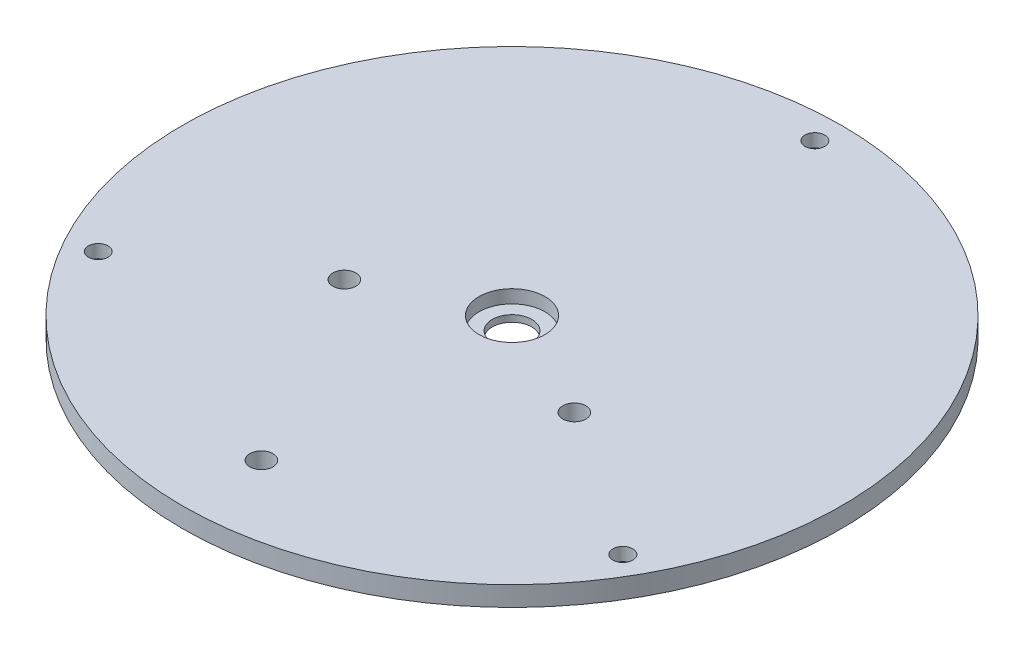
ISO-10303-21;
HEADER;
FILE_DESCRIPTION(('STEP AP214'),'2;1');
FILE_NAME('part.step','',(''),(''),'','','');
FILE_SCHEMA(('AUTOMOTIVE_DESIGN { 1 0 10303 214 1 1 1 1 }'));
ENDSEC;
DATA;
#1=APPLICATION_CONTEXT('core data for automotive mechanical design processes');
#2=APPLICATION_PROTOCOL_DEFINITION('international standard','automotive_design',2000,#1);
#3=PRODUCT_CONTEXT('',#1,'mechanical');
#4=PRODUCT('Part','Part','',(#3));
#5=PRODUCT_RELATED_PRODUCT_CATEGORY('part','',(#4));
#6=PRODUCT_DEFINITION_FORMATION('','',#4);
#7=PRODUCT_DEFINITION_CONTEXT('part definition',#1,'design');
#8=PRODUCT_DEFINITION('design','',#6,#7);
#9=PRODUCT_DEFINITION_SHAPE('','',#8);
#10=(LENGTH_UNIT() NAMED_UNIT(*) SI_UNIT(.MILLI.,.METRE.));
#11=(NAMED_UNIT(*) PLANE_ANGLE_UNIT() SI_UNIT($,.RADIAN.));
#12=(NAMED_UNIT(*) SI_UNIT($,.STERADIAN.) SOLID_ANGLE_UNIT());
#13=UNCERTAINTY_MEASURE_WITH_UNIT(LENGTH_MEASURE(1.E-05),#10,'distance_accuracy_value','');
#14=(GEOMETRIC_REPRESENTATION_CONTEXT(3) GLOBAL_UNCERTAINTY_ASSIGNED_CONTEXT((#13)) GLOBAL_UNIT_ASSIGNED_CONTEXT((#10,
#11,#12)) REPRESENTATION_CONTEXT('',''));
#15=CARTESIAN_POINT('',(0.,0.,0.));
#16=DIRECTION('',(0.,0.,1.));
#17=DIRECTION('',(1.,0.,0.));
#18=AXIS2_PLACEMENT_3D('',#15,#16,#17);
#19=CARTESIAN_POINT('',(0.,3.,0.));
#20=DIRECTION('',(0.,-1.,0.));
#21=DIRECTION('',(0.,0.,-1.));
#22=AXIS2_PLACEMENT_3D('',#19,#20,#21);
#23=CYLINDRICAL_SURFACE('',#22,3.);
#24=CARTESIAN_POINT('',(0.,0.,0.));
#25=DIRECTION('',(0.,1.,0.));
#26=DIRECTION('',(0.,0.,1.));
#27=AXIS2_PLACEMENT_3D('',#24,#25,#26);
#28=CIRCLE('',#27,3.);
#29=CARTESIAN_POINT('',(0.,0.,3.));
#30=VERTEX_POINT('',#29);
#31=EDGE_CURVE('E66',#30,#30,#28,.T.);
#32=ORIENTED_EDGE('',*,*,#31,.F.);
#33=EDGE_LOOP('',(#32));
#34=FACE_BOUND('',#33,.T.);
#35=CARTESIAN_POINT('',(0.,1.,0.));
#36=DIRECTION('',(0.,1.,0.));
#37=DIRECTION('',(0.,0.,1.));
#38=AXIS2_PLACEMENT_3D('',#35,#36,#37);
#39=CIRCLE('',#38,3.);
#40=CARTESIAN_POINT('',(0.,1.,3.));
#41=VERTEX_POINT('',#40);
#42=EDGE_CURVE('E58',#41,#41,#39,.T.);
#43=ORIENTED_EDGE('',*,*,#42,.T.);
#44=EDGE_LOOP('',(#43));
#45=FACE_BOUND('',#44,.T.);
#46=ADVANCED_FACE('F31',(#34,#45),#23,.F.);
#47=CARTESIAN_POINT('',(0.,3.,0.));
#48=DIRECTION('',(0.,1.,0.));
#49=DIRECTION('',(0.,0.,1.));
#50=AXIS2_PLACEMENT_3D('',#47,#48,#49);
#51=PLANE('',#50);
#52=CARTESIAN_POINT('',(0.,3.,0.));
#53=DIRECTION('',(0.,1.,0.));
#54=DIRECTION('',(0.,0.,1.));
#55=AXIS2_PLACEMENT_3D('',#52,#53,#54);
#56=CIRCLE('',#55,5.);
#57=CARTESIAN_POINT('',(0.,3.,5.));
#58=VERTEX_POINT('',#57);
#59=EDGE_CURVE('E97',#58,#58,#56,.T.);
#60=ORIENTED_EDGE('',*,*,#59,.F.);
#61=EDGE_LOOP('',(#60));
#62=FACE_BOUND('',#61,.T.);
#63=CARTESIAN_POINT('',(39.8,3.,22.9785407137468));
#64=DIRECTION('',(0.,1.,0.));
#65=DIRECTION('',(0.,0.,-1.));
#66=AXIS2_PLACEMENT_3D('',#63,#64,#65);
#67=CIRCLE('',#66,1.50000000000001);
#68=CARTESIAN_POINT('',(39.8,3.,21.4785407137468));
#69=VERTEX_POINT('',#68);
#70=EDGE_CURVE('E87',#69,#69,#67,.T.);
#71=ORIENTED_EDGE('',*,*,#70,.F.);
#72=EDGE_LOOP('',(#71));
#73=FACE_BOUND('',#72,.T.);
#74=CARTESIAN_POINT('',(0.,3.,-45.95));
#75=DIRECTION('',(0.,1.,0.));
#76=DIRECTION('',(0.,0.,1.));
#77=AXIS2_PLACEMENT_3D('',#74,#75,#76);
#78=CIRCLE('',#77,1.5);
#79=CARTESIAN_POINT('',(0.,3.,-44.45));
#80=VERTEX_POINT('',#79);
#81=EDGE_CURVE('E78',#80,#80,#78,.T.);
#82=ORIENTED_EDGE('',*,*,#81,.F.);
#83=EDGE_LOOP('',(#82));
#84=FACE_BOUND('',#83,.T.);
#85=CARTESIAN_POINT('',(-39.8,3.,22.9785407137468));
#86=DIRECTION('',(0.,1.,0.));
#87=DIRECTION('',(0.,0.,1.));
#88=AXIS2_PLACEMENT_3D('',#85,#86,#87);
#89=CIRCLE('',#88,1.50000000000001);
#90=CARTESIAN_POINT('',(-39.8,3.,24.4785407137468));
#91=VERTEX_POINT('',#90);
#92=EDGE_CURVE('E71',#91,#91,#89,.T.);
#93=ORIENTED_EDGE('',*,*,#92,.F.);
#94=EDGE_LOOP('',(#93));
#95=FACE_BOUND('',#94,.T.);
#96=CARTESIAN_POINT('',(0.,3.,0.));
#97=DIRECTION('',(0.,1.,0.));
#98=DIRECTION('',(0.,0.,1.));
#99=AXIS2_PLACEMENT_3D('',#96,#97,#98);
#100=CIRCLE('',#99,50.);
#101=CARTESIAN_POINT('',(0.,3.,50.));
#102=VERTEX_POINT('',#101);
#103=EDGE_CURVE('E57',#102,#102,#100,.T.);
#104=ORIENTED_EDGE('',*,*,#103,.T.);
#105=EDGE_LOOP('',(#104));
#106=FACE_BOUND('',#105,.T.);
#107=CARTESIAN_POINT('',(-17.45,3.,7.98923376740622));
#108=DIRECTION('',(0.,1.,0.));
#109=DIRECTION('',(0.,0.,1.));
#110=AXIS2_PLACEMENT_3D('',#107,#108,#109);
#111=CIRCLE('',#110,1.75);
#112=CARTESIAN_POINT('',(-17.45,3.,9.73923376740622));
#113=VERTEX_POINT('',#112);
#114=EDGE_CURVE('E74',#113,#113,#111,.T.);
#115=ORIENTED_EDGE('',*,*,#114,.F.);
#116=EDGE_LOOP('',(#115));
#117=FACE_BOUND('',#116,.T.);
#118=CARTESIAN_POINT('',(0.,3.,38.0178));
#119=DIRECTION('',(0.,1.,0.));
#120=DIRECTION('',(0.,0.,1.));
#121=AXIS2_PLACEMENT_3D('',#118,#119,#120);
#122=CIRCLE('',#121,1.75);
#123=CARTESIAN_POINT('',(0.,3.,39.7678));
#124=VERTEX_POINT('',#123);
#125=EDGE_CURVE('E83',#124,#124,#122,.T.);
#126=ORIENTED_EDGE('',*,*,#125,.F.);
#127=EDGE_LOOP('',(#126));
#128=FACE_BOUND('',#127,.T.);
#129=CARTESIAN_POINT('',(17.45,3.,7.98923376740622));
#130=DIRECTION('',(0.,1.,0.));
#131=DIRECTION('',(0.,0.,-1.));
#132=AXIS2_PLACEMENT_3D('',#129,#130,#131);
#133=CIRCLE('',#132,1.75);
#134=CARTESIAN_POINT('',(17.45,3.,6.23923376740621));
#135=VERTEX_POINT('',#134);
#136=EDGE_CURVE('E92',#135,#135,#133,.T.);
#137=ORIENTED_EDGE('',*,*,#136,.F.);
#138=EDGE_LOOP('',(#137));
#139=FACE_BOUND('',#138,.T.);
#140=ADVANCED_FACE('F112',(#62,#73,#84,#95,#106,#117,#128,#139),#51,.T.);
#141=CARTESIAN_POINT('',(0.,0.,0.));
#142=DIRECTION('',(0.,1.,0.));
#143=DIRECTION('',(0.,0.,1.));
#144=AXIS2_PLACEMENT_3D('',#141,#142,#143);
#145=PLANE('',#144);
#146=CARTESIAN_POINT('',(0.,0.,-45.95));
#147=DIRECTION('',(0.,1.,0.));
#148=DIRECTION('',(0.,0.,1.));
#149=AXIS2_PLACEMENT_3D('',#146,#147,#148);
#150=CIRCLE('',#149,2.49999999999999);
#151=CARTESIAN_POINT('',(0.,0.,-43.45));
#152=VERTEX_POINT('',#151);
#153=EDGE_CURVE('E46',#152,#152,#150,.T.);
#154=ORIENTED_EDGE('',*,*,#153,.T.);
#155=EDGE_LOOP('',(#154));
#156=FACE_BOUND('',#155,.T.);
#157=CARTESIAN_POINT('',(-39.8,0.,22.9785407137468));
#158=DIRECTION('',(0.,1.,0.));
#159=DIRECTION('',(0.,0.,1.));
#160=AXIS2_PLACEMENT_3D('',#157,#158,#159);
#161=CIRCLE('',#160,2.49999999999999);
#162=CARTESIAN_POINT('',(-39.8,0.,25.4785407137468));
#163=VERTEX_POINT('',#162);
#164=EDGE_CURVE('E51',#163,#163,#161,.T.);
#165=ORIENTED_EDGE('',*,*,#164,.T.);
#166=EDGE_LOOP('',(#165));
#167=FACE_BOUND('',#166,.T.);
#168=CARTESIAN_POINT('',(39.8,0.,22.9785407137468));
#169=DIRECTION('',(0.,1.,0.));
#170=DIRECTION('',(0.,0.,1.));
#171=AXIS2_PLACEMENT_3D('',#168,#169,#170);
#172=CIRCLE('',#171,2.49999999999999);
#173=CARTESIAN_POINT('',(39.8,0.,25.4785407137468));
#174=VERTEX_POINT('',#173);
#175=EDGE_CURVE('E54',#174,#174,#172,.T.);
#176=ORIENTED_EDGE('',*,*,#175,.T.);
#177=EDGE_LOOP('',(#176));
#178=FACE_BOUND('',#177,.T.);
#179=CARTESIAN_POINT('',(0.,0.,0.));
#180=DIRECTION('',(0.,1.,0.));
#181=DIRECTION('',(0.,0.,1.));
#182=AXIS2_PLACEMENT_3D('',#179,#180,#181);
#183=CIRCLE('',#182,50.);
#184=CARTESIAN_POINT('',(0.,0.,50.));
#185=VERTEX_POINT('',#184);
#186=EDGE_CURVE('E63',#185,#185,#183,.T.);
#187=ORIENTED_EDGE('',*,*,#186,.F.);
#188=EDGE_LOOP('',(#187));
#189=FACE_BOUND('',#188,.T.);
#190=ORIENTED_EDGE('',*,*,#31,.T.);
#191=EDGE_LOOP('',(#190));
#192=FACE_BOUND('',#191,.T.);
#193=CARTESIAN_POINT('',(-17.45,0.,7.98923376740622));
#194=DIRECTION('',(0.,1.,0.));
#195=DIRECTION('',(0.,0.,1.));
#196=AXIS2_PLACEMENT_3D('',#193,#194,#195);
#197=CIRCLE('',#196,1.75);
#198=CARTESIAN_POINT('',(-17.45,0.,9.73923376740622));
#199=VERTEX_POINT('',#198);
#200=EDGE_CURVE('E75',#199,#199,#197,.T.);
#201=ORIENTED_EDGE('',*,*,#200,.T.);
#202=EDGE_LOOP('',(#201));
#203=FACE_BOUND('',#202,.T.);
#204=CARTESIAN_POINT('',(0.,0.,38.0178));
#205=DIRECTION('',(0.,1.,0.));
#206=DIRECTION('',(0.,0.,1.));
#207=AXIS2_PLACEMENT_3D('',#204,#205,#206);
#208=CIRCLE('',#207,1.75);
#209=CARTESIAN_POINT('',(0.,0.,39.7678));
#210=VERTEX_POINT('',#209);
#211=EDGE_CURVE('E84',#210,#210,#208,.T.);
#212=ORIENTED_EDGE('',*,*,#211,.T.);
#213=EDGE_LOOP('',(#212));
#214=FACE_BOUND('',#213,.T.);
#215=CARTESIAN_POINT('',(17.45,0.,7.98923376740622));
#216=DIRECTION('',(0.,1.,0.));
#217=DIRECTION('',(0.,0.,-1.));
#218=AXIS2_PLACEMENT_3D('',#215,#216,#217);
#219=CIRCLE('',#218,1.75);
#220=CARTESIAN_POINT('',(17.45,0.,6.23923376740621));
#221=VERTEX_POINT('',#220);
#222=EDGE_CURVE('E61',#221,#221,#219,.T.);
#223=ORIENTED_EDGE('',*,*,#222,.T.);
#224=EDGE_LOOP('',(#223));
#225=FACE_BOUND('',#224,.T.);
#226=ADVANCED_FACE('F115',(#156,#167,#178,#189,#192,#203,#214,#225),#145,.F.);
#227=CARTESIAN_POINT('',(0.,3.,0.));
#228=DIRECTION('',(0.,-1.,0.));
#229=DIRECTION('',(0.,0.,-1.));
#230=AXIS2_PLACEMENT_3D('',#227,#228,#229);
#231=CYLINDRICAL_SURFACE('',#230,50.);
#232=ORIENTED_EDGE('',*,*,#103,.F.);
#233=EDGE_LOOP('',(#232));
#234=FACE_BOUND('',#233,.T.);
#235=ORIENTED_EDGE('',*,*,#186,.T.);
#236=EDGE_LOOP('',(#235));
#237=FACE_BOUND('',#236,.T.);
#238=ADVANCED_FACE('F138',(#234,#237),#231,.T.);
#239=CARTESIAN_POINT('',(-39.8,3.,22.9785407137468));
#240=DIRECTION('',(0.,-1.,0.));
#241=DIRECTION('',(0.,0.,-1.));
#242=AXIS2_PLACEMENT_3D('',#239,#240,#241);
#243=CYLINDRICAL_SURFACE('',#242,1.50000000000001);
#244=CARTESIAN_POINT('',(-39.8,0.999999999999986,22.9785407137468));
#245=DIRECTION('',(0.,1.,0.));
#246=DIRECTION('',(0.,0.,1.));
#247=AXIS2_PLACEMENT_3D('',#244,#245,#246);
#248=CIRCLE('',#247,1.50000000000001);
#249=CARTESIAN_POINT('',(-39.8,0.999999999999986,24.4785407137468));
#250=VERTEX_POINT('',#249);
#251=EDGE_CURVE('E38',#250,#250,#248,.F.);
#252=ORIENTED_EDGE('',*,*,#251,.T.);
#253=EDGE_LOOP('',(#252));
#254=FACE_BOUND('',#253,.T.);
#255=ORIENTED_EDGE('',*,*,#92,.T.);
#256=EDGE_LOOP('',(#255));
#257=FACE_BOUND('',#256,.T.);
#258=ADVANCED_FACE('F144',(#254,#257),#243,.F.);
#259=CARTESIAN_POINT('',(-17.45,3.,7.98923376740622));
#260=DIRECTION('',(0.,-1.,0.));
#261=DIRECTION('',(0.,0.,-1.));
#262=AXIS2_PLACEMENT_3D('',#259,#260,#261);
#263=CYLINDRICAL_SURFACE('',#262,1.75);
#264=ORIENTED_EDGE('',*,*,#114,.T.);
#265=EDGE_LOOP('',(#264));
#266=FACE_BOUND('',#265,.T.);
#267=ORIENTED_EDGE('',*,*,#200,.F.);
#268=EDGE_LOOP('',(#267));
#269=FACE_BOUND('',#268,.T.);
#270=ADVANCED_FACE('F158',(#266,#269),#263,.F.);
#271=CARTESIAN_POINT('',(0.,3.,-45.95));
#272=DIRECTION('',(0.,-1.,0.));
#273=DIRECTION('',(0.,0.,-1.));
#274=AXIS2_PLACEMENT_3D('',#271,#272,#273);
#275=CYLINDRICAL_SURFACE('',#274,1.5);
#276=CARTESIAN_POINT('',(0.,1.00000000000001,-45.95));
#277=DIRECTION('',(0.,1.,0.));
#278=DIRECTION('',(0.,0.,1.));
#279=AXIS2_PLACEMENT_3D('',#276,#277,#278);
#280=CIRCLE('',#279,1.5);
#281=CARTESIAN_POINT('',(0.,1.00000000000001,-44.45));
#282=VERTEX_POINT('',#281);
#283=EDGE_CURVE('E42',#282,#282,#280,.F.);
#284=ORIENTED_EDGE('',*,*,#283,.T.);
#285=EDGE_LOOP('',(#284));
#286=FACE_BOUND('',#285,.T.);
#287=ORIENTED_EDGE('',*,*,#81,.T.);
#288=EDGE_LOOP('',(#287));
#289=FACE_BOUND('',#288,.T.);
#290=ADVANCED_FACE('F161',(#286,#289),#275,.F.);
#291=CARTESIAN_POINT('',(0.,3.,38.0178));
#292=DIRECTION('',(0.,-1.,0.));
#293=DIRECTION('',(0.,0.,-1.));
#294=AXIS2_PLACEMENT_3D('',#291,#292,#293);
#295=CYLINDRICAL_SURFACE('',#294,1.75);
#296=ORIENTED_EDGE('',*,*,#125,.T.);
#297=EDGE_LOOP('',(#296));
#298=FACE_BOUND('',#297,.T.);
#299=ORIENTED_EDGE('',*,*,#211,.F.);
#300=EDGE_LOOP('',(#299));
#301=FACE_BOUND('',#300,.T.);
#302=ADVANCED_FACE('F165',(#298,#301),#295,.F.);
#303=CARTESIAN_POINT('',(39.8,3.,22.9785407137468));
#304=DIRECTION('',(0.,-1.,0.));
#305=DIRECTION('',(0.,0.,-1.));
#306=AXIS2_PLACEMENT_3D('',#303,#304,#305);
#307=CYLINDRICAL_SURFACE('',#306,1.50000000000001);
#308=CARTESIAN_POINT('',(39.8,0.999999999999986,22.9785407137468));
#309=DIRECTION('',(0.,1.,0.));
#310=DIRECTION('',(0.,0.,1.));
#311=AXIS2_PLACEMENT_3D('',#308,#309,#310);
#312=CIRCLE('',#311,1.50000000000001);
#313=CARTESIAN_POINT('',(39.8,0.999999999999986,24.4785407137468));
#314=VERTEX_POINT('',#313);
#315=EDGE_CURVE('E10',#314,#314,#312,.F.);
#316=ORIENTED_EDGE('',*,*,#315,.T.);
#317=EDGE_LOOP('',(#316));
#318=FACE_BOUND('',#317,.T.);
#319=ORIENTED_EDGE('',*,*,#70,.T.);
#320=EDGE_LOOP('',(#319));
#321=FACE_BOUND('',#320,.T.);
#322=ADVANCED_FACE('F133',(#318,#321),#307,.F.);
#323=CARTESIAN_POINT('',(17.45,3.,7.98923376740622));
#324=DIRECTION('',(0.,-1.,0.));
#325=DIRECTION('',(0.,0.,-1.));
#326=AXIS2_PLACEMENT_3D('',#323,#324,#325);
#327=CYLINDRICAL_SURFACE('',#326,1.75);
#328=ORIENTED_EDGE('',*,*,#136,.T.);
#329=EDGE_LOOP('',(#328));
#330=FACE_BOUND('',#329,.T.);
#331=ORIENTED_EDGE('',*,*,#222,.F.);
#332=EDGE_LOOP('',(#331));
#333=FACE_BOUND('',#332,.T.);
#334=ADVANCED_FACE('F108',(#330,#333),#327,.F.);
#335=CARTESIAN_POINT('',(0.,1.,0.));
#336=DIRECTION('',(0.,1.,0.));
#337=DIRECTION('',(0.,0.,1.));
#338=AXIS2_PLACEMENT_3D('',#335,#336,#337);
#339=CYLINDRICAL_SURFACE('',#338,5.);
#340=CARTESIAN_POINT('',(0.,1.,0.));
#341=DIRECTION('',(0.,1.,0.));
#342=DIRECTION('',(0.,0.,1.));
#343=AXIS2_PLACEMENT_3D('',#340,#341,#342);
#344=CIRCLE('',#343,5.);
#345=CARTESIAN_POINT('',(0.,1.,5.));
#346=VERTEX_POINT('',#345);
#347=EDGE_CURVE('E62',#346,#346,#344,.T.);
#348=ORIENTED_EDGE('',*,*,#347,.F.);
#349=EDGE_LOOP('',(#348));
#350=FACE_BOUND('',#349,.T.);
#351=ORIENTED_EDGE('',*,*,#59,.T.);
#352=EDGE_LOOP('',(#351));
#353=FACE_BOUND('',#352,.T.);
#354=ADVANCED_FACE('F105',(#350,#353),#339,.F.);
#355=CARTESIAN_POINT('',(0.,1.,0.));
#356=DIRECTION('',(0.,1.,0.));
#357=DIRECTION('',(0.,0.,1.));
#358=AXIS2_PLACEMENT_3D('',#355,#356,#357);
#359=PLANE('',#358);
#360=ORIENTED_EDGE('',*,*,#42,.F.);
#361=EDGE_LOOP('',(#360));
#362=FACE_BOUND('',#361,.T.);
#363=ORIENTED_EDGE('',*,*,#347,.T.);
#364=EDGE_LOOP('',(#363));
#365=FACE_BOUND('',#364,.T.);
#366=ADVANCED_FACE('F103',(#362,#365),#359,.T.);
#367=CARTESIAN_POINT('',(0.,0.,-45.95));
#368=DIRECTION('',(0.,-1.,0.));
#369=DIRECTION('',(0.,0.,-1.));
#370=AXIS2_PLACEMENT_3D('',#367,#368,#369);
#371=CONICAL_SURFACE('',#370,2.49999999999999,0.785398163397435);
#372=ORIENTED_EDGE('',*,*,#283,.F.);
#373=EDGE_LOOP('',(#372));
#374=FACE_BOUND('',#373,.T.);
#375=ORIENTED_EDGE('',*,*,#153,.F.);
#376=EDGE_LOOP('',(#375));
#377=FACE_BOUND('',#376,.T.);
#378=ADVANCED_FACE('F173',(#374,#377),#371,.F.);
#379=CARTESIAN_POINT('',(-39.8,0.,22.9785407137468));
#380=DIRECTION('',(0.,-1.,0.));
#381=DIRECTION('',(0.,0.,-1.));
#382=AXIS2_PLACEMENT_3D('',#379,#380,#381);
#383=CONICAL_SURFACE('',#382,2.49999999999999,0.785398163397444);
#384=ORIENTED_EDGE('',*,*,#251,.F.);
#385=EDGE_LOOP('',(#384));
#386=FACE_BOUND('',#385,.T.);
#387=ORIENTED_EDGE('',*,*,#164,.F.);
#388=EDGE_LOOP('',(#387));
#389=FACE_BOUND('',#388,.T.);
#390=ADVANCED_FACE('F178',(#386,#389),#383,.F.);
#391=CARTESIAN_POINT('',(39.8,0.,22.9785407137468));
#392=DIRECTION('',(0.,-1.,0.));
#393=DIRECTION('',(0.,0.,-1.));
#394=AXIS2_PLACEMENT_3D('',#391,#392,#393);
#395=CONICAL_SURFACE('',#394,2.49999999999999,0.785398163397444);
#396=ORIENTED_EDGE('',*,*,#315,.F.);
#397=EDGE_LOOP('',(#396));
#398=FACE_BOUND('',#397,.T.);
#399=ORIENTED_EDGE('',*,*,#175,.F.);
#400=EDGE_LOOP('',(#399));
#401=FACE_BOUND('',#400,.T.);
#402=ADVANCED_FACE('F33',(#398,#401),#395,.F.);
#403=CLOSED_SHELL('',(#46,#140,#226,#238,#258,#270,#290,#302,#322,#334,#354,#366,#378,#390,#402));
#404=MANIFOLD_SOLID_BREP('B2',#403);
#405=ADVANCED_BREP_SHAPE_REPRESENTATION('',(#18,#404),#14);
#406=SHAPE_DEFINITION_REPRESENTATION(#9,#405);
ENDSEC;
END-ISO-10303-21;
